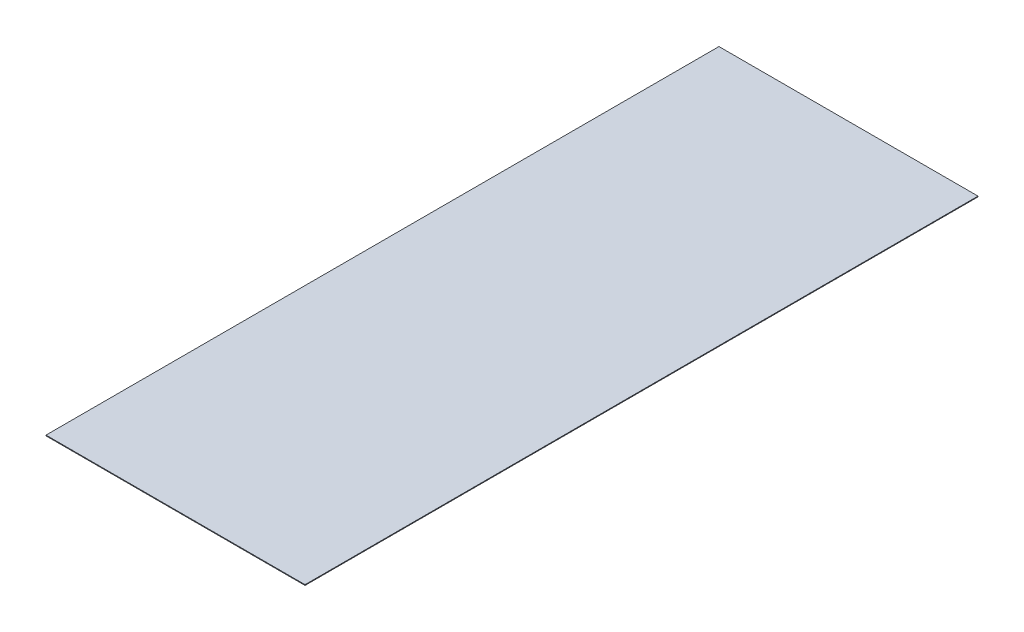
ISO-10303-21;
HEADER;
FILE_DESCRIPTION(('STEP AP214'),'2;1');
FILE_NAME('part.step','',(''),(''),'','','');
FILE_SCHEMA(('AUTOMOTIVE_DESIGN { 1 0 10303 214 1 1 1 1 }'));
ENDSEC;
DATA;
#1=APPLICATION_CONTEXT('core data for automotive mechanical design processes');
#2=APPLICATION_PROTOCOL_DEFINITION('international standard','automotive_design',2000,#1);
#3=PRODUCT_CONTEXT('',#1,'mechanical');
#4=PRODUCT('Part','Part','',(#3));
#5=PRODUCT_RELATED_PRODUCT_CATEGORY('part','',(#4));
#6=PRODUCT_DEFINITION_FORMATION('','',#4);
#7=PRODUCT_DEFINITION_CONTEXT('part definition',#1,'design');
#8=PRODUCT_DEFINITION('design','',#6,#7);
#9=PRODUCT_DEFINITION_SHAPE('','',#8);
#10=(LENGTH_UNIT() NAMED_UNIT(*) SI_UNIT(.MILLI.,.METRE.));
#11=(NAMED_UNIT(*) PLANE_ANGLE_UNIT() SI_UNIT($,.RADIAN.));
#12=(NAMED_UNIT(*) SI_UNIT($,.STERADIAN.) SOLID_ANGLE_UNIT());
#13=UNCERTAINTY_MEASURE_WITH_UNIT(LENGTH_MEASURE(1.E-05),#10,'distance_accuracy_value','');
#14=(GEOMETRIC_REPRESENTATION_CONTEXT(3) GLOBAL_UNCERTAINTY_ASSIGNED_CONTEXT((#13)) GLOBAL_UNIT_ASSIGNED_CONTEXT((#10,
#11,#12)) REPRESENTATION_CONTEXT('',''));
#15=CARTESIAN_POINT('',(0.,0.,0.));
#16=DIRECTION('',(0.,0.,1.));
#17=DIRECTION('',(1.,0.,0.));
#18=AXIS2_PLACEMENT_3D('',#15,#16,#17);
#19=CARTESIAN_POINT('',(0.,0.5,0.));
#20=DIRECTION('',(1.,0.,0.));
#21=DIRECTION('',(0.,0.,-1.));
#22=AXIS2_PLACEMENT_3D('',#19,#20,#21);
#23=PLANE('',#22);
#24=DIRECTION('',(0.,0.,1.));
#25=VECTOR('',#24,1.);
#26=CARTESIAN_POINT('',(0.,0.,0.));
#27=LINE('',#26,#25);
#28=CARTESIAN_POINT('',(0.,0.,-478.));
#29=VERTEX_POINT('',#28);
#30=CARTESIAN_POINT('',(0.,0.,0.));
#31=VERTEX_POINT('',#30);
#32=EDGE_CURVE('E107',#29,#31,#27,.T.);
#33=ORIENTED_EDGE('',*,*,#32,.T.);
#34=DIRECTION('',(0.,-1.,0.));
#35=VECTOR('',#34,1.);
#36=CARTESIAN_POINT('',(0.,0.5,0.));
#37=LINE('',#36,#35);
#38=CARTESIAN_POINT('',(0.,0.5,0.));
#39=VERTEX_POINT('',#38);
#40=EDGE_CURVE('E11',#39,#31,#37,.T.);
#41=ORIENTED_EDGE('',*,*,#40,.F.);
#42=DIRECTION('',(0.,0.,1.));
#43=VECTOR('',#42,1.);
#44=CARTESIAN_POINT('',(0.,0.5,0.));
#45=LINE('',#44,#43);
#46=CARTESIAN_POINT('',(0.,0.5,-478.));
#47=VERTEX_POINT('',#46);
#48=EDGE_CURVE('E91',#47,#39,#45,.T.);
#49=ORIENTED_EDGE('',*,*,#48,.F.);
#50=DIRECTION('',(0.,-1.,0.));
#51=VECTOR('',#50,1.);
#52=CARTESIAN_POINT('',(0.,0.5,-478.));
#53=LINE('',#52,#51);
#54=EDGE_CURVE('E103',#47,#29,#53,.T.);
#55=ORIENTED_EDGE('',*,*,#54,.T.);
#56=EDGE_LOOP('',(#33,#41,#49,#55));
#57=FACE_BOUND('',#56,.T.);
#58=ADVANCED_FACE('F39',(#57),#23,.F.);
#59=CARTESIAN_POINT('',(0.,0.5,0.));
#60=DIRECTION('',(0.,0.,-1.));
#61=DIRECTION('',(-1.,0.,0.));
#62=AXIS2_PLACEMENT_3D('',#59,#60,#61);
#63=PLANE('',#62);
#64=DIRECTION('',(1.,0.,0.));
#65=VECTOR('',#64,1.);
#66=CARTESIAN_POINT('',(0.,0.,0.));
#67=LINE('',#66,#65);
#68=CARTESIAN_POINT('',(184.,0.,0.));
#69=VERTEX_POINT('',#68);
#70=EDGE_CURVE('E96',#31,#69,#67,.T.);
#71=ORIENTED_EDGE('',*,*,#70,.T.);
#72=DIRECTION('',(0.,-1.,0.));
#73=VECTOR('',#72,1.);
#74=CARTESIAN_POINT('',(184.,0.5,0.));
#75=LINE('',#74,#73);
#76=CARTESIAN_POINT('',(184.,0.5,0.));
#77=VERTEX_POINT('',#76);
#78=EDGE_CURVE('E48',#77,#69,#75,.T.);
#79=ORIENTED_EDGE('',*,*,#78,.F.);
#80=DIRECTION('',(1.,0.,0.));
#81=VECTOR('',#80,1.);
#82=CARTESIAN_POINT('',(0.,0.5,0.));
#83=LINE('',#82,#81);
#84=EDGE_CURVE('E86',#39,#77,#83,.T.);
#85=ORIENTED_EDGE('',*,*,#84,.F.);
#86=ORIENTED_EDGE('',*,*,#40,.T.);
#87=EDGE_LOOP('',(#71,#79,#85,#86));
#88=FACE_BOUND('',#87,.T.);
#89=ADVANCED_FACE('F95',(#88),#63,.F.);
#90=CARTESIAN_POINT('',(184.,0.5,0.));
#91=DIRECTION('',(-1.,0.,0.));
#92=DIRECTION('',(0.,0.,1.));
#93=AXIS2_PLACEMENT_3D('',#90,#91,#92);
#94=PLANE('',#93);
#95=DIRECTION('',(0.,0.,-1.));
#96=VECTOR('',#95,1.);
#97=CARTESIAN_POINT('',(184.,0.,0.));
#98=LINE('',#97,#96);
#99=CARTESIAN_POINT('',(184.,0.,-478.));
#100=VERTEX_POINT('',#99);
#101=EDGE_CURVE('E73',#69,#100,#98,.T.);
#102=ORIENTED_EDGE('',*,*,#101,.T.);
#103=DIRECTION('',(0.,-1.,0.));
#104=VECTOR('',#103,1.);
#105=CARTESIAN_POINT('',(184.,0.5,-478.));
#106=LINE('',#105,#104);
#107=CARTESIAN_POINT('',(184.,0.5,-478.));
#108=VERTEX_POINT('',#107);
#109=EDGE_CURVE('E98',#108,#100,#106,.T.);
#110=ORIENTED_EDGE('',*,*,#109,.F.);
#111=DIRECTION('',(0.,0.,-1.));
#112=VECTOR('',#111,1.);
#113=CARTESIAN_POINT('',(184.,0.5,0.));
#114=LINE('',#113,#112);
#115=EDGE_CURVE('E89',#77,#108,#114,.T.);
#116=ORIENTED_EDGE('',*,*,#115,.F.);
#117=ORIENTED_EDGE('',*,*,#78,.T.);
#118=EDGE_LOOP('',(#102,#110,#116,#117));
#119=FACE_BOUND('',#118,.T.);
#120=ADVANCED_FACE('F99',(#119),#94,.F.);
#121=CARTESIAN_POINT('',(0.,0.5,-478.));
#122=DIRECTION('',(0.,0.,1.));
#123=DIRECTION('',(1.,0.,0.));
#124=AXIS2_PLACEMENT_3D('',#121,#122,#123);
#125=PLANE('',#124);
#126=DIRECTION('',(-1.,0.,0.));
#127=VECTOR('',#126,1.);
#128=CARTESIAN_POINT('',(0.,0.,-478.));
#129=LINE('',#128,#127);
#130=EDGE_CURVE('E79',#100,#29,#129,.T.);
#131=ORIENTED_EDGE('',*,*,#130,.T.);
#132=ORIENTED_EDGE('',*,*,#54,.F.);
#133=DIRECTION('',(-1.,0.,0.));
#134=VECTOR('',#133,1.);
#135=CARTESIAN_POINT('',(0.,0.5,-478.));
#136=LINE('',#135,#134);
#137=EDGE_CURVE('E56',#108,#47,#136,.T.);
#138=ORIENTED_EDGE('',*,*,#137,.F.);
#139=ORIENTED_EDGE('',*,*,#109,.T.);
#140=EDGE_LOOP('',(#131,#132,#138,#139));
#141=FACE_BOUND('',#140,.T.);
#142=ADVANCED_FACE('F120',(#141),#125,.F.);
#143=CARTESIAN_POINT('',(0.,0.5,0.));
#144=DIRECTION('',(0.,-1.,0.));
#145=DIRECTION('',(0.,0.,-1.));
#146=AXIS2_PLACEMENT_3D('',#143,#144,#145);
#147=PLANE('',#146);
#148=ORIENTED_EDGE('',*,*,#48,.T.);
#149=ORIENTED_EDGE('',*,*,#84,.T.);
#150=ORIENTED_EDGE('',*,*,#115,.T.);
#151=ORIENTED_EDGE('',*,*,#137,.T.);
#152=EDGE_LOOP('',(#148,#149,#150,#151));
#153=FACE_BOUND('',#152,.T.);
#154=ADVANCED_FACE('F87',(#153),#147,.F.);
#155=CARTESIAN_POINT('',(0.,0.,0.));
#156=DIRECTION('',(0.,-1.,0.));
#157=DIRECTION('',(0.,0.,-1.));
#158=AXIS2_PLACEMENT_3D('',#155,#156,#157);
#159=PLANE('',#158);
#160=ORIENTED_EDGE('',*,*,#32,.F.);
#161=ORIENTED_EDGE('',*,*,#130,.F.);
#162=ORIENTED_EDGE('',*,*,#101,.F.);
#163=ORIENTED_EDGE('',*,*,#70,.F.);
#164=EDGE_LOOP('',(#160,#161,#162,#163));
#165=FACE_BOUND('',#164,.T.);
#166=ADVANCED_FACE('F123',(#165),#159,.T.);
#167=CLOSED_SHELL('',(#58,#89,#120,#142,#154,#166));
#168=MANIFOLD_SOLID_BREP('B2',#167);
#169=ADVANCED_BREP_SHAPE_REPRESENTATION('',(#18,#168),#14);
#170=SHAPE_DEFINITION_REPRESENTATION(#9,#169);
ENDSEC;
END-ISO-10303-21;
